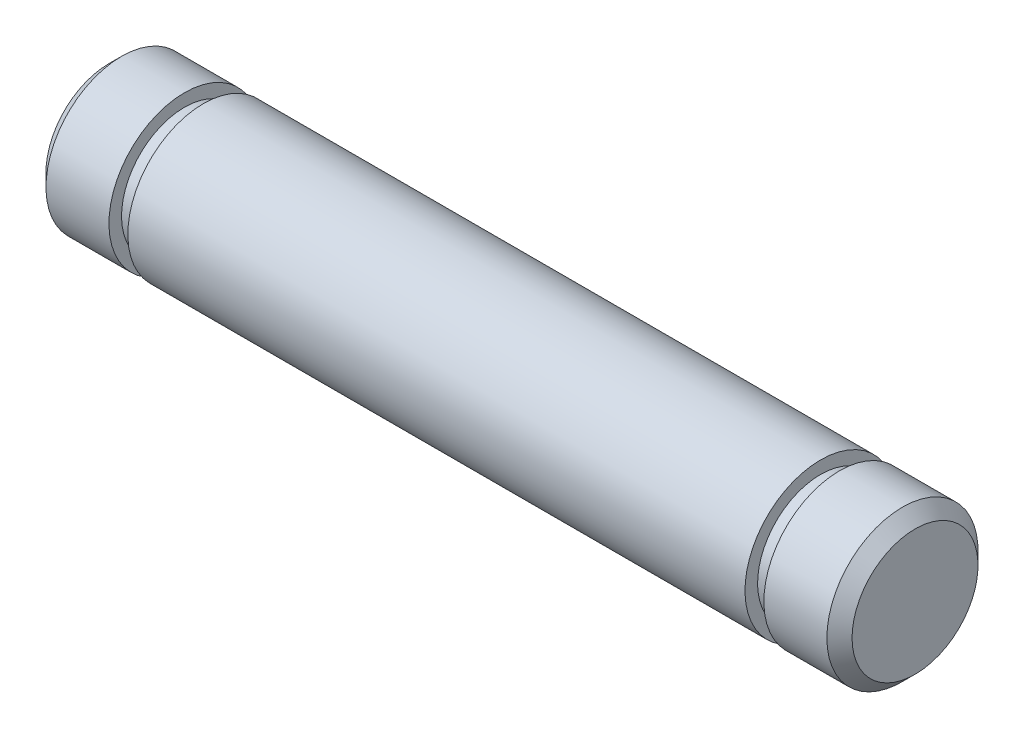
ISO-10303-21;
HEADER;
FILE_DESCRIPTION(('STEP AP214'),'2;1');
FILE_NAME('part.step','',(''),(''),'','','');
FILE_SCHEMA(('AUTOMOTIVE_DESIGN { 1 0 10303 214 1 1 1 1 }'));
ENDSEC;
DATA;
#1=APPLICATION_CONTEXT('core data for automotive mechanical design processes');
#2=APPLICATION_PROTOCOL_DEFINITION('international standard','automotive_design',2000,#1);
#3=PRODUCT_CONTEXT('',#1,'mechanical');
#4=PRODUCT('Part','Part','',(#3));
#5=PRODUCT_RELATED_PRODUCT_CATEGORY('part','',(#4));
#6=PRODUCT_DEFINITION_FORMATION('','',#4);
#7=PRODUCT_DEFINITION_CONTEXT('part definition',#1,'design');
#8=PRODUCT_DEFINITION('design','',#6,#7);
#9=PRODUCT_DEFINITION_SHAPE('','',#8);
#10=(LENGTH_UNIT() NAMED_UNIT(*) SI_UNIT(.MILLI.,.METRE.));
#11=(NAMED_UNIT(*) PLANE_ANGLE_UNIT() SI_UNIT($,.RADIAN.));
#12=(NAMED_UNIT(*) SI_UNIT($,.STERADIAN.) SOLID_ANGLE_UNIT());
#13=UNCERTAINTY_MEASURE_WITH_UNIT(LENGTH_MEASURE(1.E-05),#10,'distance_accuracy_value','');
#14=(GEOMETRIC_REPRESENTATION_CONTEXT(3) GLOBAL_UNCERTAINTY_ASSIGNED_CONTEXT((#13)) GLOBAL_UNIT_ASSIGNED_CONTEXT((#10,
#11,#12)) REPRESENTATION_CONTEXT('',''));
#15=CARTESIAN_POINT('',(0.,0.,0.));
#16=DIRECTION('',(0.,0.,1.));
#17=DIRECTION('',(1.,0.,0.));
#18=AXIS2_PLACEMENT_3D('',#15,#16,#17);
#19=CARTESIAN_POINT('',(32.,1.50000000000001,0.));
#20=DIRECTION('',(1.,0.,0.));
#21=DIRECTION('',(0.,0.,-1.));
#22=AXIS2_PLACEMENT_3D('',#19,#20,#21);
#23=PLANE('',#22);
#24=CARTESIAN_POINT('',(32.0000000002665,0.,0.));
#25=DIRECTION('',(-1.,0.,0.));
#26=DIRECTION('',(0.,0.,1.));
#27=AXIS2_PLACEMENT_3D('',#24,#25,#26);
#28=CIRCLE('',#27,2.50000000016826);
#29=CARTESIAN_POINT('',(32.0000000002665,0.,2.50000000016826));
#30=VERTEX_POINT('',#29);
#31=EDGE_CURVE('E18',#30,#30,#28,.T.);
#32=ORIENTED_EDGE('',*,*,#31,.F.);
#33=EDGE_LOOP('',(#32));
#34=FACE_BOUND('',#33,.T.);
#35=ADVANCED_FACE('F15',(#34),#23,.T.);
#36=CARTESIAN_POINT('',(0.,1.5,0.));
#37=DIRECTION('',(-1.,0.,0.));
#38=DIRECTION('',(0.,0.,1.));
#39=AXIS2_PLACEMENT_3D('',#36,#37,#38);
#40=PLANE('',#39);
#41=CARTESIAN_POINT('',(-2.27374217544318E-10,0.,0.));
#42=DIRECTION('',(1.,0.,0.));
#43=DIRECTION('',(0.,1.,0.));
#44=AXIS2_PLACEMENT_3D('',#41,#42,#43);
#45=CIRCLE('',#44,2.5000000002251);
#46=CARTESIAN_POINT('',(-2.27374849995586E-10,2.5000000002251,0.));
#47=VERTEX_POINT('',#46);
#48=EDGE_CURVE('E50',#47,#47,#45,.T.);
#49=ORIENTED_EDGE('',*,*,#48,.F.);
#50=EDGE_LOOP('',(#49));
#51=FACE_BOUND('',#50,.T.);
#52=ADVANCED_FACE('F63',(#51),#40,.T.);
#53=CARTESIAN_POINT('',(31.4999999998804,0.,0.));
#54=DIRECTION('',(-1.,0.,0.));
#55=DIRECTION('',(0.,0.,1.));
#56=AXIS2_PLACEMENT_3D('',#53,#54,#55);
#57=CONICAL_SURFACE('',#56,2.99999999964485,0.785398162487954);
#58=ORIENTED_EDGE('',*,*,#31,.T.);
#59=EDGE_LOOP('',(#58));
#60=FACE_BOUND('',#59,.T.);
#61=CARTESIAN_POINT('',(31.5,0.,0.));
#62=DIRECTION('',(1.,0.,0.));
#63=DIRECTION('',(0.,1.,0.));
#64=AXIS2_PLACEMENT_3D('',#61,#62,#63);
#65=CIRCLE('',#64,3.);
#66=CARTESIAN_POINT('',(31.5,3.00000000000001,0.));
#67=VERTEX_POINT('',#66);
#68=EDGE_CURVE('E52',#67,#67,#65,.F.);
#69=ORIENTED_EDGE('',*,*,#68,.F.);
#70=EDGE_LOOP('',(#69));
#71=FACE_BOUND('',#70,.T.);
#72=ADVANCED_FACE('F59',(#60,#71),#57,.T.);
#73=CARTESIAN_POINT('',(0.500000000329236,0.,0.));
#74=DIRECTION('',(1.,0.,0.));
#75=DIRECTION('',(0.,1.,0.));
#76=AXIS2_PLACEMENT_3D('',#73,#74,#75);
#77=CONICAL_SURFACE('',#76,2.99999999981537,0.78539816243111);
#78=CARTESIAN_POINT('',(0.5,0.,0.));
#79=DIRECTION('',(1.,0.,0.));
#80=DIRECTION('',(0.,1.,0.));
#81=AXIS2_PLACEMENT_3D('',#78,#79,#80);
#82=CIRCLE('',#81,3.);
#83=CARTESIAN_POINT('',(0.499999999999999,3.,0.));
#84=VERTEX_POINT('',#83);
#85=EDGE_CURVE('E49',#84,#84,#82,.T.);
#86=ORIENTED_EDGE('',*,*,#85,.F.);
#87=EDGE_LOOP('',(#86));
#88=FACE_BOUND('',#87,.T.);
#89=ORIENTED_EDGE('',*,*,#48,.T.);
#90=EDGE_LOOP('',(#89));
#91=FACE_BOUND('',#90,.T.);
#92=ADVANCED_FACE('F107',(#88,#91),#77,.T.);
#93=CARTESIAN_POINT('',(30.5,0.,0.));
#94=DIRECTION('',(1.,0.,0.));
#95=DIRECTION('',(0.,1.,0.));
#96=AXIS2_PLACEMENT_3D('',#93,#94,#95);
#97=CYLINDRICAL_SURFACE('',#96,3.);
#98=ORIENTED_EDGE('',*,*,#68,.T.);
#99=EDGE_LOOP('',(#98));
#100=FACE_BOUND('',#99,.T.);
#101=CARTESIAN_POINT('',(29.,0.,0.));
#102=DIRECTION('',(1.,0.,0.));
#103=DIRECTION('',(0.,1.,0.));
#104=AXIS2_PLACEMENT_3D('',#101,#102,#103);
#105=CIRCLE('',#104,3.);
#106=CARTESIAN_POINT('',(29.,3.00000000000001,0.));
#107=VERTEX_POINT('',#106);
#108=EDGE_CURVE('E47',#107,#107,#105,.F.);
#109=ORIENTED_EDGE('',*,*,#108,.F.);
#110=EDGE_LOOP('',(#109));
#111=FACE_BOUND('',#110,.T.);
#112=ADVANCED_FACE('F103',(#100,#111),#97,.T.);
#113=CARTESIAN_POINT('',(1.5,0.,0.));
#114=DIRECTION('',(1.,0.,0.));
#115=DIRECTION('',(0.,1.,0.));
#116=AXIS2_PLACEMENT_3D('',#113,#114,#115);
#117=CYLINDRICAL_SURFACE('',#116,3.);
#118=ORIENTED_EDGE('',*,*,#85,.T.);
#119=EDGE_LOOP('',(#118));
#120=FACE_BOUND('',#119,.T.);
#121=CARTESIAN_POINT('',(3.,0.,0.));
#122=DIRECTION('',(1.,0.,0.));
#123=DIRECTION('',(0.,1.,0.));
#124=AXIS2_PLACEMENT_3D('',#121,#122,#123);
#125=CIRCLE('',#124,3.);
#126=CARTESIAN_POINT('',(2.99999999999999,3.,0.));
#127=VERTEX_POINT('',#126);
#128=EDGE_CURVE('E44',#127,#127,#125,.T.);
#129=ORIENTED_EDGE('',*,*,#128,.F.);
#130=EDGE_LOOP('',(#129));
#131=FACE_BOUND('',#130,.T.);
#132=ADVANCED_FACE('F99',(#120,#131),#117,.T.);
#133=CARTESIAN_POINT('',(29.,2.75000000000001,0.));
#134=DIRECTION('',(-1.,0.,0.));
#135=DIRECTION('',(0.,0.,1.));
#136=AXIS2_PLACEMENT_3D('',#133,#134,#135);
#137=PLANE('',#136);
#138=CARTESIAN_POINT('',(29.,0.,0.));
#139=DIRECTION('',(1.,0.,0.));
#140=DIRECTION('',(0.,1.,0.));
#141=AXIS2_PLACEMENT_3D('',#138,#139,#140);
#142=CIRCLE('',#141,2.5);
#143=CARTESIAN_POINT('',(29.,2.50000000000001,0.));
#144=VERTEX_POINT('',#143);
#145=EDGE_CURVE('E41',#144,#144,#142,.F.);
#146=ORIENTED_EDGE('',*,*,#145,.F.);
#147=EDGE_LOOP('',(#146));
#148=FACE_BOUND('',#147,.T.);
#149=ORIENTED_EDGE('',*,*,#108,.T.);
#150=EDGE_LOOP('',(#149));
#151=FACE_BOUND('',#150,.T.);
#152=ADVANCED_FACE('F95',(#148,#151),#137,.T.);
#153=CARTESIAN_POINT('',(3.,2.75,0.));
#154=DIRECTION('',(1.,0.,0.));
#155=DIRECTION('',(0.,0.,-1.));
#156=AXIS2_PLACEMENT_3D('',#153,#154,#155);
#157=PLANE('',#156);
#158=CARTESIAN_POINT('',(3.,0.,0.));
#159=DIRECTION('',(1.,0.,0.));
#160=DIRECTION('',(0.,1.,0.));
#161=AXIS2_PLACEMENT_3D('',#158,#159,#160);
#162=CIRCLE('',#161,2.5);
#163=CARTESIAN_POINT('',(3.,2.5,0.));
#164=VERTEX_POINT('',#163);
#165=EDGE_CURVE('E38',#164,#164,#162,.T.);
#166=ORIENTED_EDGE('',*,*,#165,.F.);
#167=EDGE_LOOP('',(#166));
#168=FACE_BOUND('',#167,.T.);
#169=ORIENTED_EDGE('',*,*,#128,.T.);
#170=EDGE_LOOP('',(#169));
#171=FACE_BOUND('',#170,.T.);
#172=ADVANCED_FACE('F91',(#168,#171),#157,.T.);
#173=CARTESIAN_POINT('',(28.625,0.,0.));
#174=DIRECTION('',(1.,0.,0.));
#175=DIRECTION('',(0.,1.,0.));
#176=AXIS2_PLACEMENT_3D('',#173,#174,#175);
#177=CYLINDRICAL_SURFACE('',#176,2.5);
#178=CARTESIAN_POINT('',(28.25,0.,0.));
#179=DIRECTION('',(1.,0.,0.));
#180=DIRECTION('',(0.,1.,0.));
#181=AXIS2_PLACEMENT_3D('',#178,#179,#180);
#182=CIRCLE('',#181,2.5);
#183=CARTESIAN_POINT('',(28.25,2.50000000000001,0.));
#184=VERTEX_POINT('',#183);
#185=EDGE_CURVE('E35',#184,#184,#182,.F.);
#186=ORIENTED_EDGE('',*,*,#185,.F.);
#187=EDGE_LOOP('',(#186));
#188=FACE_BOUND('',#187,.T.);
#189=ORIENTED_EDGE('',*,*,#145,.T.);
#190=EDGE_LOOP('',(#189));
#191=FACE_BOUND('',#190,.T.);
#192=ADVANCED_FACE('F87',(#188,#191),#177,.T.);
#193=CARTESIAN_POINT('',(3.375,0.,0.));
#194=DIRECTION('',(1.,0.,0.));
#195=DIRECTION('',(0.,1.,0.));
#196=AXIS2_PLACEMENT_3D('',#193,#194,#195);
#197=CYLINDRICAL_SURFACE('',#196,2.5);
#198=ORIENTED_EDGE('',*,*,#165,.T.);
#199=EDGE_LOOP('',(#198));
#200=FACE_BOUND('',#199,.T.);
#201=CARTESIAN_POINT('',(3.75,0.,0.));
#202=DIRECTION('',(1.,0.,0.));
#203=DIRECTION('',(0.,1.,0.));
#204=AXIS2_PLACEMENT_3D('',#201,#202,#203);
#205=CIRCLE('',#204,2.5);
#206=CARTESIAN_POINT('',(3.75,2.5,0.));
#207=VERTEX_POINT('',#206);
#208=EDGE_CURVE('E27',#207,#207,#205,.T.);
#209=ORIENTED_EDGE('',*,*,#208,.F.);
#210=EDGE_LOOP('',(#209));
#211=FACE_BOUND('',#210,.T.);
#212=ADVANCED_FACE('F83',(#200,#211),#197,.T.);
#213=CARTESIAN_POINT('',(28.25,2.75000000000001,0.));
#214=DIRECTION('',(1.,0.,0.));
#215=DIRECTION('',(0.,0.,-1.));
#216=AXIS2_PLACEMENT_3D('',#213,#214,#215);
#217=PLANE('',#216);
#218=ORIENTED_EDGE('',*,*,#185,.T.);
#219=EDGE_LOOP('',(#218));
#220=FACE_BOUND('',#219,.T.);
#221=CARTESIAN_POINT('',(28.25,0.,0.));
#222=DIRECTION('',(1.,0.,0.));
#223=DIRECTION('',(0.,1.,0.));
#224=AXIS2_PLACEMENT_3D('',#221,#222,#223);
#225=CIRCLE('',#224,3.);
#226=CARTESIAN_POINT('',(28.25,3.00000000000001,0.));
#227=VERTEX_POINT('',#226);
#228=EDGE_CURVE('E22',#227,#227,#225,.F.);
#229=ORIENTED_EDGE('',*,*,#228,.F.);
#230=EDGE_LOOP('',(#229));
#231=FACE_BOUND('',#230,.T.);
#232=ADVANCED_FACE('F76',(#220,#231),#217,.T.);
#233=CARTESIAN_POINT('',(3.75,2.75,0.));
#234=DIRECTION('',(-1.,0.,0.));
#235=DIRECTION('',(0.,0.,1.));
#236=AXIS2_PLACEMENT_3D('',#233,#234,#235);
#237=PLANE('',#236);
#238=ORIENTED_EDGE('',*,*,#208,.T.);
#239=EDGE_LOOP('',(#238));
#240=FACE_BOUND('',#239,.T.);
#241=CARTESIAN_POINT('',(3.75,0.,0.));
#242=DIRECTION('',(1.,0.,0.));
#243=DIRECTION('',(0.,1.,0.));
#244=AXIS2_PLACEMENT_3D('',#241,#242,#243);
#245=CIRCLE('',#244,3.);
#246=CARTESIAN_POINT('',(3.75,3.,0.));
#247=VERTEX_POINT('',#246);
#248=EDGE_CURVE('E10',#247,#247,#245,.T.);
#249=ORIENTED_EDGE('',*,*,#248,.F.);
#250=EDGE_LOOP('',(#249));
#251=FACE_BOUND('',#250,.T.);
#252=ADVANCED_FACE('F71',(#240,#251),#237,.T.);
#253=CARTESIAN_POINT('',(16.,0.,0.));
#254=DIRECTION('',(1.,0.,0.));
#255=DIRECTION('',(0.,1.,0.));
#256=AXIS2_PLACEMENT_3D('',#253,#254,#255);
#257=CYLINDRICAL_SURFACE('',#256,3.);
#258=ORIENTED_EDGE('',*,*,#248,.T.);
#259=EDGE_LOOP('',(#258));
#260=FACE_BOUND('',#259,.T.);
#261=ORIENTED_EDGE('',*,*,#228,.T.);
#262=EDGE_LOOP('',(#261));
#263=FACE_BOUND('',#262,.T.);
#264=ADVANCED_FACE('F69',(#260,#263),#257,.T.);
#265=CLOSED_SHELL('',(#35,#52,#72,#92,#112,#132,#152,#172,#192,#212,#232,#252,#264));
#266=MANIFOLD_SOLID_BREP('B1',#265);
#267=ADVANCED_BREP_SHAPE_REPRESENTATION('',(#18,#266),#14);
#268=SHAPE_DEFINITION_REPRESENTATION(#9,#267);
ENDSEC;
END-ISO-10303-21;
